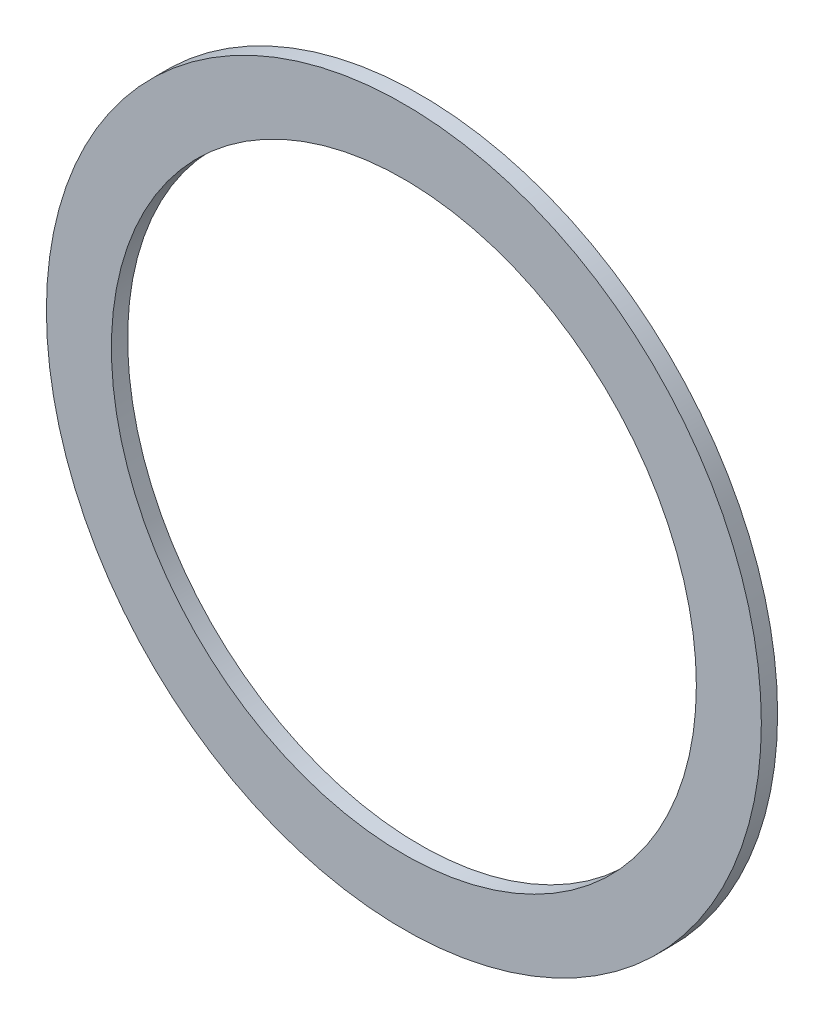
ISO-10303-21;
HEADER;
FILE_DESCRIPTION(('STEP AP214'),'2;1');
FILE_NAME('part.step','',(''),(''),'','','');
FILE_SCHEMA(('AUTOMOTIVE_DESIGN { 1 0 10303 214 1 1 1 1 }'));
ENDSEC;
DATA;
#1=APPLICATION_CONTEXT('core data for automotive mechanical design processes');
#2=APPLICATION_PROTOCOL_DEFINITION('international standard','automotive_design',2000,#1);
#3=PRODUCT_CONTEXT('',#1,'mechanical');
#4=PRODUCT('Part','Part','',(#3));
#5=PRODUCT_RELATED_PRODUCT_CATEGORY('part','',(#4));
#6=PRODUCT_DEFINITION_FORMATION('','',#4);
#7=PRODUCT_DEFINITION_CONTEXT('part definition',#1,'design');
#8=PRODUCT_DEFINITION('design','',#6,#7);
#9=PRODUCT_DEFINITION_SHAPE('','',#8);
#10=(LENGTH_UNIT() NAMED_UNIT(*) SI_UNIT(.MILLI.,.METRE.));
#11=(NAMED_UNIT(*) PLANE_ANGLE_UNIT() SI_UNIT($,.RADIAN.));
#12=(NAMED_UNIT(*) SI_UNIT($,.STERADIAN.) SOLID_ANGLE_UNIT());
#13=UNCERTAINTY_MEASURE_WITH_UNIT(LENGTH_MEASURE(1.E-05),#10,'distance_accuracy_value','');
#14=(GEOMETRIC_REPRESENTATION_CONTEXT(3) GLOBAL_UNCERTAINTY_ASSIGNED_CONTEXT((#13)) GLOBAL_UNIT_ASSIGNED_CONTEXT((#10,
#11,#12)) REPRESENTATION_CONTEXT('',''));
#15=CARTESIAN_POINT('',(0.,0.,0.));
#16=DIRECTION('',(0.,0.,1.));
#17=DIRECTION('',(1.,0.,0.));
#18=AXIS2_PLACEMENT_3D('',#15,#16,#17);
#19=CARTESIAN_POINT('',(0.,0.,0.5));
#20=DIRECTION('',(0.,0.,1.));
#21=DIRECTION('',(1.,0.,0.));
#22=AXIS2_PLACEMENT_3D('',#19,#20,#21);
#23=PLANE('',#22);
#24=CARTESIAN_POINT('',(0.,0.,0.5));
#25=DIRECTION('',(0.,0.,1.));
#26=DIRECTION('',(1.,0.,0.));
#27=AXIS2_PLACEMENT_3D('',#24,#25,#26);
#28=CIRCLE('',#27,11.);
#29=CARTESIAN_POINT('',(11.,0.,0.5));
#30=VERTEX_POINT('',#29);
#31=EDGE_CURVE('E10',#30,#30,#28,.T.);
#32=ORIENTED_EDGE('',*,*,#31,.T.);
#33=EDGE_LOOP('',(#32));
#34=FACE_BOUND('',#33,.T.);
#35=CARTESIAN_POINT('',(0.,0.,0.5));
#36=DIRECTION('',(0.,0.,1.));
#37=DIRECTION('',(1.,0.,0.));
#38=AXIS2_PLACEMENT_3D('',#35,#36,#37);
#39=CIRCLE('',#38,9.);
#40=CARTESIAN_POINT('',(9.,0.,0.5));
#41=VERTEX_POINT('',#40);
#42=EDGE_CURVE('E50',#41,#41,#39,.T.);
#43=ORIENTED_EDGE('',*,*,#42,.F.);
#44=EDGE_LOOP('',(#43));
#45=FACE_BOUND('',#44,.T.);
#46=ADVANCED_FACE('F37',(#34,#45),#23,.T.);
#47=CARTESIAN_POINT('',(0.,0.,0.));
#48=DIRECTION('',(0.,0.,1.));
#49=DIRECTION('',(1.,0.,0.));
#50=AXIS2_PLACEMENT_3D('',#47,#48,#49);
#51=PLANE('',#50);
#52=CARTESIAN_POINT('',(0.,0.,0.));
#53=DIRECTION('',(0.,0.,1.));
#54=DIRECTION('',(1.,0.,0.));
#55=AXIS2_PLACEMENT_3D('',#52,#53,#54);
#56=CIRCLE('',#55,11.);
#57=CARTESIAN_POINT('',(11.,0.,0.));
#58=VERTEX_POINT('',#57);
#59=EDGE_CURVE('E41',#58,#58,#56,.T.);
#60=ORIENTED_EDGE('',*,*,#59,.F.);
#61=EDGE_LOOP('',(#60));
#62=FACE_BOUND('',#61,.T.);
#63=CARTESIAN_POINT('',(0.,0.,0.));
#64=DIRECTION('',(0.,0.,1.));
#65=DIRECTION('',(1.,0.,0.));
#66=AXIS2_PLACEMENT_3D('',#63,#64,#65);
#67=CIRCLE('',#66,9.);
#68=CARTESIAN_POINT('',(9.,0.,0.));
#69=VERTEX_POINT('',#68);
#70=EDGE_CURVE('E52',#69,#69,#67,.T.);
#71=ORIENTED_EDGE('',*,*,#70,.T.);
#72=EDGE_LOOP('',(#71));
#73=FACE_BOUND('',#72,.T.);
#74=ADVANCED_FACE('F64',(#62,#73),#51,.F.);
#75=CARTESIAN_POINT('',(0.,0.,0.5));
#76=DIRECTION('',(0.,0.,-1.));
#77=DIRECTION('',(-1.,0.,0.));
#78=AXIS2_PLACEMENT_3D('',#75,#76,#77);
#79=CYLINDRICAL_SURFACE('',#78,11.);
#80=ORIENTED_EDGE('',*,*,#31,.F.);
#81=EDGE_LOOP('',(#80));
#82=FACE_BOUND('',#81,.T.);
#83=ORIENTED_EDGE('',*,*,#59,.T.);
#84=EDGE_LOOP('',(#83));
#85=FACE_BOUND('',#84,.T.);
#86=ADVANCED_FACE('F39',(#82,#85),#79,.T.);
#87=CARTESIAN_POINT('',(0.,0.,0.5));
#88=DIRECTION('',(0.,0.,-1.));
#89=DIRECTION('',(-1.,0.,0.));
#90=AXIS2_PLACEMENT_3D('',#87,#88,#89);
#91=CYLINDRICAL_SURFACE('',#90,9.);
#92=ORIENTED_EDGE('',*,*,#42,.T.);
#93=EDGE_LOOP('',(#92));
#94=FACE_BOUND('',#93,.T.);
#95=ORIENTED_EDGE('',*,*,#70,.F.);
#96=EDGE_LOOP('',(#95));
#97=FACE_BOUND('',#96,.T.);
#98=ADVANCED_FACE('F60',(#94,#97),#91,.F.);
#99=CLOSED_SHELL('',(#46,#74,#86,#98));
#100=MANIFOLD_SOLID_BREP('B2',#99);
#101=ADVANCED_BREP_SHAPE_REPRESENTATION('',(#18,#100),#14);
#102=SHAPE_DEFINITION_REPRESENTATION(#9,#101);
ENDSEC;
END-ISO-10303-21;
